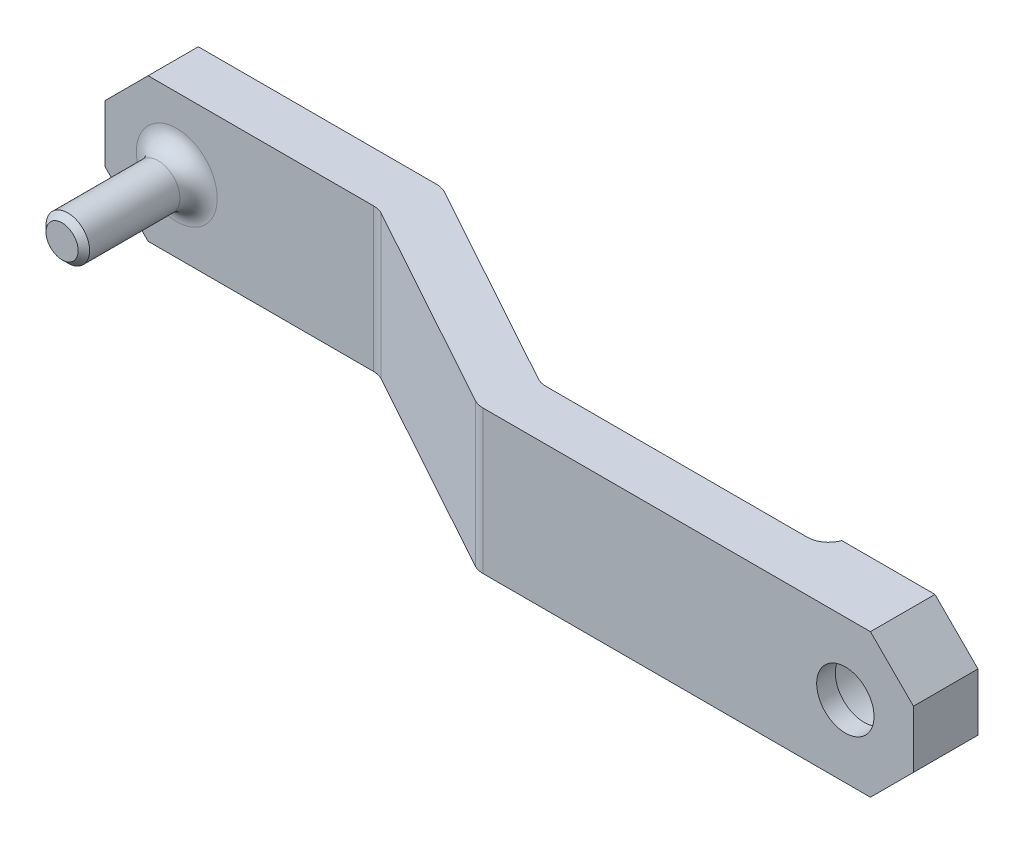
ISO-10303-21;
HEADER;
FILE_DESCRIPTION(('STEP AP214'),'2;1');
FILE_NAME('part.step','',(''),(''),'','','');
FILE_SCHEMA(('AUTOMOTIVE_DESIGN { 1 0 10303 214 1 1 1 1 }'));
ENDSEC;
DATA;
#1=APPLICATION_CONTEXT('core data for automotive mechanical design processes');
#2=APPLICATION_PROTOCOL_DEFINITION('international standard','automotive_design',2000,#1);
#3=PRODUCT_CONTEXT('',#1,'mechanical');
#4=PRODUCT('Part','Part','',(#3));
#5=PRODUCT_RELATED_PRODUCT_CATEGORY('part','',(#4));
#6=PRODUCT_DEFINITION_FORMATION('','',#4);
#7=PRODUCT_DEFINITION_CONTEXT('part definition',#1,'design');
#8=PRODUCT_DEFINITION('design','',#6,#7);
#9=PRODUCT_DEFINITION_SHAPE('','',#8);
#10=(LENGTH_UNIT() NAMED_UNIT(*) SI_UNIT(.MILLI.,.METRE.));
#11=(NAMED_UNIT(*) PLANE_ANGLE_UNIT() SI_UNIT($,.RADIAN.));
#12=(NAMED_UNIT(*) SI_UNIT($,.STERADIAN.) SOLID_ANGLE_UNIT());
#13=UNCERTAINTY_MEASURE_WITH_UNIT(LENGTH_MEASURE(1.E-05),#10,'distance_accuracy_value','');
#14=(GEOMETRIC_REPRESENTATION_CONTEXT(3) GLOBAL_UNCERTAINTY_ASSIGNED_CONTEXT((#13)) GLOBAL_UNIT_ASSIGNED_CONTEXT((#10,
#11,#12)) REPRESENTATION_CONTEXT('',''));
#15=CARTESIAN_POINT('',(0.,0.,0.));
#16=DIRECTION('',(0.,0.,1.));
#17=DIRECTION('',(1.,0.,0.));
#18=AXIS2_PLACEMENT_3D('',#15,#16,#17);
#19=CARTESIAN_POINT('',(25.4,12.7,0.));
#20=DIRECTION('',(0.,0.,1.));
#21=DIRECTION('',(1.,0.,0.));
#22=AXIS2_PLACEMENT_3D('',#19,#20,#21);
#23=PLANE('',#22);
#24=DIRECTION('',(-1.,0.,0.));
#25=VECTOR('',#24,1.);
#26=CARTESIAN_POINT('',(25.4,12.7,0.));
#27=LINE('',#26,#25);
#28=CARTESIAN_POINT('',(24.9106727681502,12.7,0.));
#29=VERTEX_POINT('',#28);
#30=CARTESIAN_POINT('',(3.80999999999999,12.7,0.));
#31=VERTEX_POINT('',#30);
#32=EDGE_CURVE('E532',#29,#31,#27,.T.);
#33=ORIENTED_EDGE('',*,*,#32,.F.);
#34=DIRECTION('',(0.,-1.,0.));
#35=VECTOR('',#34,1.);
#36=CARTESIAN_POINT('',(24.9106727681502,12.7,0.));
#37=LINE('',#36,#35);
#38=CARTESIAN_POINT('',(24.9106727681502,0.,0.));
#39=VERTEX_POINT('',#38);
#40=EDGE_CURVE('E669',#29,#39,#37,.T.);
#41=ORIENTED_EDGE('',*,*,#40,.T.);
#42=DIRECTION('',(-1.,0.,0.));
#43=VECTOR('',#42,1.);
#44=CARTESIAN_POINT('',(25.4,0.,0.));
#45=LINE('',#44,#43);
#46=CARTESIAN_POINT('',(3.81000000000001,0.,0.));
#47=VERTEX_POINT('',#46);
#48=EDGE_CURVE('E531',#39,#47,#45,.T.);
#49=ORIENTED_EDGE('',*,*,#48,.T.);
#50=DIRECTION('',(0.707106781186549,-0.707106781186546,0.));
#51=VECTOR('',#50,1.);
#52=CARTESIAN_POINT('',(0.,3.80999999999999,0.));
#53=LINE('',#52,#51);
#54=CARTESIAN_POINT('',(0.,3.80999999999999,0.));
#55=VERTEX_POINT('',#54);
#56=EDGE_CURVE('E642',#47,#55,#53,.F.);
#57=ORIENTED_EDGE('',*,*,#56,.T.);
#58=DIRECTION('',(0.,-1.,0.));
#59=VECTOR('',#58,1.);
#60=CARTESIAN_POINT('',(0.,12.7,0.));
#61=LINE('',#60,#59);
#62=CARTESIAN_POINT('',(0.,8.88999999999999,0.));
#63=VERTEX_POINT('',#62);
#64=EDGE_CURVE('E579',#63,#55,#61,.T.);
#65=ORIENTED_EDGE('',*,*,#64,.F.);
#66=DIRECTION('',(0.707106781186546,0.707106781186549,0.));
#67=VECTOR('',#66,1.);
#68=CARTESIAN_POINT('',(3.80999999999999,12.7,0.));
#69=LINE('',#68,#67);
#70=EDGE_CURVE('E638',#63,#31,#69,.T.);
#71=ORIENTED_EDGE('',*,*,#70,.T.);
#72=EDGE_LOOP('',(#33,#41,#49,#57,#65,#71));
#73=FACE_BOUND('',#72,.T.);
#74=ADVANCED_FACE('F47',(#73),#23,.F.);
#75=CARTESIAN_POINT('',(0.,12.7,0.));
#76=DIRECTION('',(1.,0.,0.));
#77=DIRECTION('',(0.,0.,-1.));
#78=AXIS2_PLACEMENT_3D('',#75,#76,#77);
#79=PLANE('',#78);
#80=ORIENTED_EDGE('',*,*,#64,.T.);
#81=DIRECTION('',(0.,0.,1.));
#82=VECTOR('',#81,1.);
#83=CARTESIAN_POINT('',(0.,3.80999999999999,0.));
#84=LINE('',#83,#82);
#85=CARTESIAN_POINT('',(0.,3.80999999999999,4.445));
#86=VERTEX_POINT('',#85);
#87=EDGE_CURVE('E628',#55,#86,#84,.T.);
#88=ORIENTED_EDGE('',*,*,#87,.T.);
#89=DIRECTION('',(0.,-1.,0.));
#90=VECTOR('',#89,1.);
#91=CARTESIAN_POINT('',(0.,12.7,4.445));
#92=LINE('',#91,#90);
#93=CARTESIAN_POINT('',(0.,8.88999999999999,4.445));
#94=VERTEX_POINT('',#93);
#95=EDGE_CURVE('E575',#94,#86,#92,.T.);
#96=ORIENTED_EDGE('',*,*,#95,.F.);
#97=DIRECTION('',(0.,0.,-1.));
#98=VECTOR('',#97,1.);
#99=CARTESIAN_POINT('',(0.,8.88999999999999,0.));
#100=LINE('',#99,#98);
#101=EDGE_CURVE('E625',#94,#63,#100,.T.);
#102=ORIENTED_EDGE('',*,*,#101,.T.);
#103=EDGE_LOOP('',(#80,#88,#96,#102));
#104=FACE_BOUND('',#103,.T.);
#105=ADVANCED_FACE('F239',(#104),#79,.F.);
#106=CARTESIAN_POINT('',(0.,12.7,4.445));
#107=DIRECTION('',(0.,0.,-1.));
#108=DIRECTION('',(-1.,0.,0.));
#109=AXIS2_PLACEMENT_3D('',#106,#107,#108);
#110=PLANE('',#109);
#111=CARTESIAN_POINT('',(6.35,6.35,4.445));
#112=DIRECTION('',(0.,0.,-1.));
#113=DIRECTION('',(-1.,0.,0.));
#114=AXIS2_PLACEMENT_3D('',#111,#112,#113);
#115=CIRCLE('',#114,3.5814);
#116=CARTESIAN_POINT('',(2.7686,6.35,4.445));
#117=VERTEX_POINT('',#116);
#118=EDGE_CURVE('E583',#117,#117,#115,.T.);
#119=ORIENTED_EDGE('',*,*,#118,.T.);
#120=EDGE_LOOP('',(#119));
#121=FACE_BOUND('',#120,.T.);
#122=DIRECTION('',(1.,0.,0.));
#123=VECTOR('',#122,1.);
#124=CARTESIAN_POINT('',(0.,0.,4.445));
#125=LINE('',#124,#123);
#126=CARTESIAN_POINT('',(3.81000000000001,0.,4.445));
#127=VERTEX_POINT('',#126);
#128=CARTESIAN_POINT('',(23.7689092271673,0.,4.445));
#129=VERTEX_POINT('',#128);
#130=EDGE_CURVE('E550',#127,#129,#125,.T.);
#131=ORIENTED_EDGE('',*,*,#130,.T.);
#132=DIRECTION('',(0.,-1.,0.));
#133=VECTOR('',#132,1.);
#134=CARTESIAN_POINT('',(23.7689092271673,12.7,4.445));
#135=LINE('',#134,#133);
#136=CARTESIAN_POINT('',(23.7689092271673,12.7,4.445));
#137=VERTEX_POINT('',#136);
#138=EDGE_CURVE('E64',#129,#137,#135,.F.);
#139=ORIENTED_EDGE('',*,*,#138,.T.);
#140=DIRECTION('',(1.,0.,0.));
#141=VECTOR('',#140,1.);
#142=CARTESIAN_POINT('',(0.,12.7,4.445));
#143=LINE('',#142,#141);
#144=CARTESIAN_POINT('',(3.80999999999999,12.7,4.445));
#145=VERTEX_POINT('',#144);
#146=EDGE_CURVE('E535',#145,#137,#143,.T.);
#147=ORIENTED_EDGE('',*,*,#146,.F.);
#148=DIRECTION('',(-0.707106781186546,-0.707106781186549,0.));
#149=VECTOR('',#148,1.);
#150=CARTESIAN_POINT('',(3.80999999999999,12.7,4.445));
#151=LINE('',#150,#149);
#152=EDGE_CURVE('E632',#145,#94,#151,.T.);
#153=ORIENTED_EDGE('',*,*,#152,.T.);
#154=ORIENTED_EDGE('',*,*,#95,.T.);
#155=DIRECTION('',(-0.707106781186549,0.707106781186546,0.));
#156=VECTOR('',#155,1.);
#157=CARTESIAN_POINT('',(0.,3.80999999999999,4.445));
#158=LINE('',#157,#156);
#159=EDGE_CURVE('E635',#86,#127,#158,.F.);
#160=ORIENTED_EDGE('',*,*,#159,.T.);
#161=EDGE_LOOP('',(#131,#139,#147,#153,#154,#160));
#162=FACE_BOUND('',#161,.T.);
#163=ADVANCED_FACE('F247',(#121,#162),#110,.F.);
#164=CARTESIAN_POINT('',(24.2582364590171,12.7,4.445));
#165=DIRECTION('',(0.481931775013495,0.,-0.876208744667811));
#166=DIRECTION('',(-0.876208744667811,0.,-0.481931775013495));
#167=AXIS2_PLACEMENT_3D('',#164,#165,#166);
#168=PLANE('',#167);
#169=DIRECTION('',(0.876208744667811,0.,0.481931775013495));
#170=VECTOR('',#169,1.);
#171=CARTESIAN_POINT('',(24.2582364590171,0.,4.445));
#172=LINE('',#171,#170);
#173=CARTESIAN_POINT('',(24.686989258568,0.,4.68082234140782));
#174=VERTEX_POINT('',#173);
#175=CARTESIAN_POINT('',(43.1969836594662,0.,14.8616776585922));
#176=VERTEX_POINT('',#175);
#177=EDGE_CURVE('E553',#174,#176,#172,.T.);
#178=ORIENTED_EDGE('',*,*,#177,.T.);
#179=DIRECTION('',(0.,-1.,0.));
#180=VECTOR('',#179,1.);
#181=CARTESIAN_POINT('',(43.1969836594662,12.7,14.8616776585922));
#182=LINE('',#181,#180);
#183=CARTESIAN_POINT('',(43.1969836594662,12.7,14.8616776585922));
#184=VERTEX_POINT('',#183);
#185=EDGE_CURVE('E659',#176,#184,#182,.F.);
#186=ORIENTED_EDGE('',*,*,#185,.T.);
#187=DIRECTION('',(0.876208744667811,0.,0.481931775013495));
#188=VECTOR('',#187,1.);
#189=CARTESIAN_POINT('',(24.2582364590171,12.7,4.445));
#190=LINE('',#189,#188);
#191=CARTESIAN_POINT('',(24.686989258568,12.7,4.68082234140782));
#192=VERTEX_POINT('',#191);
#193=EDGE_CURVE('E539',#192,#184,#190,.T.);
#194=ORIENTED_EDGE('',*,*,#193,.F.);
#195=DIRECTION('',(0.,-1.,0.));
#196=VECTOR('',#195,1.);
#197=CARTESIAN_POINT('',(24.686989258568,0.,4.68082234140782));
#198=LINE('',#197,#196);
#199=EDGE_CURVE('E655',#192,#174,#198,.T.);
#200=ORIENTED_EDGE('',*,*,#199,.T.);
#201=EDGE_LOOP('',(#178,#186,#194,#200));
#202=FACE_BOUND('',#201,.T.);
#203=ADVANCED_FACE('F455',(#202),#168,.F.);
#204=CARTESIAN_POINT('',(43.6257364590171,12.7,15.0975));
#205=DIRECTION('',(0.,0.,-1.));
#206=DIRECTION('',(-1.,0.,0.));
#207=AXIS2_PLACEMENT_3D('',#204,#205,#206);
#208=PLANE('',#207);
#209=CARTESIAN_POINT('',(76.2,6.35,15.0975));
#210=DIRECTION('',(0.,0.,-1.));
#211=DIRECTION('',(-1.,0.,0.));
#212=AXIS2_PLACEMENT_3D('',#209,#210,#211);
#213=CIRCLE('',#212,2.54);
#214=CARTESIAN_POINT('',(73.66,6.35,15.0975));
#215=VERTEX_POINT('',#214);
#216=EDGE_CURVE('E518',#215,#215,#213,.T.);
#217=ORIENTED_EDGE('',*,*,#216,.T.);
#218=EDGE_LOOP('',(#217));
#219=FACE_BOUND('',#218,.T.);
#220=DIRECTION('',(1.,0.,0.));
#221=VECTOR('',#220,1.);
#222=CARTESIAN_POINT('',(43.6257364590171,12.7,15.0975));
#223=LINE('',#222,#221);
#224=CARTESIAN_POINT('',(44.1150636908669,12.7,15.0975));
#225=VERTEX_POINT('',#224);
#226=CARTESIAN_POINT('',(78.4225,12.7,15.0975));
#227=VERTEX_POINT('',#226);
#228=EDGE_CURVE('E189',#225,#227,#223,.T.);
#229=ORIENTED_EDGE('',*,*,#228,.F.);
#230=DIRECTION('',(0.,-1.,0.));
#231=VECTOR('',#230,1.);
#232=CARTESIAN_POINT('',(44.1150636908669,12.7,15.0975));
#233=LINE('',#232,#231);
#234=CARTESIAN_POINT('',(44.1150636908669,0.,15.0975));
#235=VERTEX_POINT('',#234);
#236=EDGE_CURVE('E645',#225,#235,#233,.T.);
#237=ORIENTED_EDGE('',*,*,#236,.T.);
#238=DIRECTION('',(1.,0.,0.));
#239=VECTOR('',#238,1.);
#240=CARTESIAN_POINT('',(43.6257364590171,0.,15.0975));
#241=LINE('',#240,#239);
#242=CARTESIAN_POINT('',(78.4225,0.,15.0975));
#243=VERTEX_POINT('',#242);
#244=EDGE_CURVE('E557',#235,#243,#241,.T.);
#245=ORIENTED_EDGE('',*,*,#244,.T.);
#246=DIRECTION('',(-0.707106781186549,-0.707106781186546,0.));
#247=VECTOR('',#246,1.);
#248=CARTESIAN_POINT('',(82.2325,3.80999999999999,15.0975));
#249=LINE('',#248,#247);
#250=CARTESIAN_POINT('',(82.2325,3.80999999999999,15.0975));
#251=VERTEX_POINT('',#250);
#252=EDGE_CURVE('E616',#243,#251,#249,.F.);
#253=ORIENTED_EDGE('',*,*,#252,.T.);
#254=DIRECTION('',(0.,-1.,0.));
#255=VECTOR('',#254,1.);
#256=CARTESIAN_POINT('',(82.2325,12.7,15.0975));
#257=LINE('',#256,#255);
#258=CARTESIAN_POINT('',(82.2325,8.88999999999998,15.0975));
#259=VERTEX_POINT('',#258);
#260=EDGE_CURVE('E571',#259,#251,#257,.T.);
#261=ORIENTED_EDGE('',*,*,#260,.F.);
#262=DIRECTION('',(-0.707106781186546,0.707106781186549,0.));
#263=VECTOR('',#262,1.);
#264=CARTESIAN_POINT('',(78.4225,12.7,15.0975));
#265=LINE('',#264,#263);
#266=EDGE_CURVE('E612',#259,#227,#265,.T.);
#267=ORIENTED_EDGE('',*,*,#266,.T.);
#268=EDGE_LOOP('',(#229,#237,#245,#253,#261,#267));
#269=FACE_BOUND('',#268,.T.);
#270=ADVANCED_FACE('F451',(#219,#269),#208,.F.);
#271=CARTESIAN_POINT('',(82.2325,12.7,15.0975));
#272=DIRECTION('',(-1.,0.,0.));
#273=DIRECTION('',(0.,0.,1.));
#274=AXIS2_PLACEMENT_3D('',#271,#272,#273);
#275=PLANE('',#274);
#276=ORIENTED_EDGE('',*,*,#260,.T.);
#277=DIRECTION('',(0.,0.,-1.));
#278=VECTOR('',#277,1.);
#279=CARTESIAN_POINT('',(82.2325,3.80999999999999,15.0975));
#280=LINE('',#279,#278);
#281=CARTESIAN_POINT('',(82.2325,3.80999999999999,9.38250000000001));
#282=VERTEX_POINT('',#281);
#283=EDGE_CURVE('E594',#251,#282,#280,.T.);
#284=ORIENTED_EDGE('',*,*,#283,.T.);
#285=DIRECTION('',(0.,-1.,0.));
#286=VECTOR('',#285,1.);
#287=CARTESIAN_POINT('',(82.2325,12.7,9.38250000000001));
#288=LINE('',#287,#286);
#289=CARTESIAN_POINT('',(82.2325,8.88999999999998,9.38250000000001));
#290=VERTEX_POINT('',#289);
#291=EDGE_CURVE('E200',#290,#282,#288,.T.);
#292=ORIENTED_EDGE('',*,*,#291,.F.);
#293=DIRECTION('',(0.,0.,1.));
#294=VECTOR('',#293,1.);
#295=CARTESIAN_POINT('',(82.2325,8.88999999999998,15.0975));
#296=LINE('',#295,#294);
#297=EDGE_CURVE('E591',#290,#259,#296,.T.);
#298=ORIENTED_EDGE('',*,*,#297,.T.);
#299=EDGE_LOOP('',(#276,#284,#292,#298));
#300=FACE_BOUND('',#299,.T.);
#301=ADVANCED_FACE('F319',(#300),#275,.F.);
#302=CARTESIAN_POINT('',(82.2325,12.7,9.38250000000001));
#303=DIRECTION('',(0.,0.,1.));
#304=DIRECTION('',(1.,0.,0.));
#305=AXIS2_PLACEMENT_3D('',#302,#303,#304);
#306=PLANE('',#305);
#307=CARTESIAN_POINT('',(76.2,6.35,9.38250000000001));
#308=DIRECTION('',(0.,0.,1.));
#309=DIRECTION('',(1.,0.,0.));
#310=AXIS2_PLACEMENT_3D('',#307,#308,#309);
#311=CIRCLE('',#310,4.73710000000002);
#312=CARTESIAN_POINT('',(80.9371,6.35,9.38250000000001));
#313=VERTEX_POINT('',#312);
#314=EDGE_CURVE('E214',#313,#313,#311,.T.);
#315=ORIENTED_EDGE('',*,*,#314,.T.);
#316=EDGE_LOOP('',(#315));
#317=FACE_BOUND('',#316,.T.);
#318=ORIENTED_EDGE('',*,*,#291,.T.);
#319=DIRECTION('',(0.707106781186549,0.707106781186546,0.));
#320=VECTOR('',#319,1.);
#321=CARTESIAN_POINT('',(82.2325,3.80999999999999,9.38250000000001));
#322=LINE('',#321,#320);
#323=CARTESIAN_POINT('',(78.4225,0.,9.38250000000001));
#324=VERTEX_POINT('',#323);
#325=EDGE_CURVE('E601',#282,#324,#322,.F.);
#326=ORIENTED_EDGE('',*,*,#325,.T.);
#327=DIRECTION('',(-1.,0.,0.));
#328=VECTOR('',#327,1.);
#329=CARTESIAN_POINT('',(82.2325,0.,9.38250000000001));
#330=LINE('',#329,#328);
#331=CARTESIAN_POINT('',(70.1675,0.,9.38250000000001));
#332=VERTEX_POINT('',#331);
#333=EDGE_CURVE('E197',#324,#332,#330,.T.);
#334=ORIENTED_EDGE('',*,*,#333,.T.);
#335=DIRECTION('',(0.,-1.,0.));
#336=VECTOR('',#335,1.);
#337=CARTESIAN_POINT('',(70.1675,12.7,9.38250000000001));
#338=LINE('',#337,#336);
#339=CARTESIAN_POINT('',(70.1675,12.7,9.38250000000001));
#340=VERTEX_POINT('',#339);
#341=EDGE_CURVE('E193',#340,#332,#338,.T.);
#342=ORIENTED_EDGE('',*,*,#341,.F.);
#343=DIRECTION('',(-1.,0.,0.));
#344=VECTOR('',#343,1.);
#345=CARTESIAN_POINT('',(82.2325,12.7,9.38250000000001));
#346=LINE('',#345,#344);
#347=CARTESIAN_POINT('',(78.4225,12.7,9.38250000000001));
#348=VERTEX_POINT('',#347);
#349=EDGE_CURVE('E176',#348,#340,#346,.T.);
#350=ORIENTED_EDGE('',*,*,#349,.F.);
#351=DIRECTION('',(0.707106781186546,-0.707106781186549,0.));
#352=VECTOR('',#351,1.);
#353=CARTESIAN_POINT('',(78.4225,12.7,9.38250000000001));
#354=LINE('',#353,#352);
#355=EDGE_CURVE('E598',#348,#290,#354,.T.);
#356=ORIENTED_EDGE('',*,*,#355,.T.);
#357=EDGE_LOOP('',(#318,#326,#334,#342,#350,#356));
#358=FACE_BOUND('',#357,.T.);
#359=ADVANCED_FACE('F195',(#317,#358),#306,.F.);
#360=CARTESIAN_POINT('',(70.1675,12.7,10.6525));
#361=DIRECTION('',(0.,0.,1.));
#362=DIRECTION('',(1.,0.,0.));
#363=AXIS2_PLACEMENT_3D('',#360,#361,#362);
#364=PLANE('',#363);
#365=DIRECTION('',(-1.,0.,0.));
#366=VECTOR('',#365,1.);
#367=CARTESIAN_POINT('',(70.1675,0.,10.6525));
#368=LINE('',#367,#366);
#369=CARTESIAN_POINT('',(68.3714487757862,0.,10.6525));
#370=VERTEX_POINT('',#369);
#371=CARTESIAN_POINT('',(45.2568272318498,0.,10.6525));
#372=VERTEX_POINT('',#371);
#373=EDGE_CURVE('E562',#370,#372,#368,.T.);
#374=ORIENTED_EDGE('',*,*,#373,.T.);
#375=DIRECTION('',(0.,-1.,0.));
#376=VECTOR('',#375,1.);
#377=CARTESIAN_POINT('',(45.2568272318498,12.7,10.6525));
#378=LINE('',#377,#376);
#379=CARTESIAN_POINT('',(45.2568272318498,12.7,10.6525));
#380=VERTEX_POINT('',#379);
#381=EDGE_CURVE('E682',#372,#380,#378,.F.);
#382=ORIENTED_EDGE('',*,*,#381,.T.);
#383=DIRECTION('',(-1.,0.,0.));
#384=VECTOR('',#383,1.);
#385=CARTESIAN_POINT('',(70.1675,12.7,10.6525));
#386=LINE('',#385,#384);
#387=CARTESIAN_POINT('',(68.3714487757862,12.7,10.6525));
#388=VERTEX_POINT('',#387);
#389=EDGE_CURVE('E188',#388,#380,#386,.T.);
#390=ORIENTED_EDGE('',*,*,#389,.F.);
#391=DIRECTION('',(0.,-1.,0.));
#392=VECTOR('',#391,1.);
#393=CARTESIAN_POINT('',(68.3714487757862,12.7,10.6525));
#394=LINE('',#393,#392);
#395=EDGE_CURVE('E206',#388,#370,#394,.T.);
#396=ORIENTED_EDGE('',*,*,#395,.T.);
#397=EDGE_LOOP('',(#374,#382,#390,#396));
#398=FACE_BOUND('',#397,.T.);
#399=ADVANCED_FACE('F318',(#398),#364,.F.);
#400=CARTESIAN_POINT('',(44.7675,12.7,10.6525));
#401=DIRECTION('',(-0.481931775013495,0.,0.876208744667811));
#402=DIRECTION('',(0.876208744667811,0.,0.481931775013495));
#403=AXIS2_PLACEMENT_3D('',#400,#401,#402);
#404=PLANE('',#403);
#405=DIRECTION('',(-0.876208744667811,0.,-0.481931775013495));
#406=VECTOR('',#405,1.);
#407=CARTESIAN_POINT('',(44.7675,0.,10.6525));
#408=LINE('',#407,#406);
#409=CARTESIAN_POINT('',(44.3387472004491,0.,10.4166776585922));
#410=VERTEX_POINT('',#409);
#411=CARTESIAN_POINT('',(25.8287527995509,0.,0.235822341407819));
#412=VERTEX_POINT('',#411);
#413=EDGE_CURVE('E536',#410,#412,#408,.T.);
#414=ORIENTED_EDGE('',*,*,#413,.T.);
#415=DIRECTION('',(0.,-1.,0.));
#416=VECTOR('',#415,1.);
#417=CARTESIAN_POINT('',(25.8287527995509,12.7,0.235822341407819));
#418=LINE('',#417,#416);
#419=CARTESIAN_POINT('',(25.8287527995509,12.7,0.235822341407819));
#420=VERTEX_POINT('',#419);
#421=EDGE_CURVE('E677',#412,#420,#418,.F.);
#422=ORIENTED_EDGE('',*,*,#421,.T.);
#423=DIRECTION('',(-0.876208744667811,0.,-0.481931775013495));
#424=VECTOR('',#423,1.);
#425=CARTESIAN_POINT('',(44.7675,12.7,10.6525));
#426=LINE('',#425,#424);
#427=CARTESIAN_POINT('',(44.3387472004491,12.7,10.4166776585922));
#428=VERTEX_POINT('',#427);
#429=EDGE_CURVE('E201',#428,#420,#426,.T.);
#430=ORIENTED_EDGE('',*,*,#429,.F.);
#431=DIRECTION('',(0.,-1.,0.));
#432=VECTOR('',#431,1.);
#433=CARTESIAN_POINT('',(44.3387472004491,0.,10.4166776585922));
#434=LINE('',#433,#432);
#435=EDGE_CURVE('E673',#428,#410,#434,.T.);
#436=ORIENTED_EDGE('',*,*,#435,.T.);
#437=EDGE_LOOP('',(#414,#422,#430,#436));
#438=FACE_BOUND('',#437,.T.);
#439=ADVANCED_FACE('F431',(#438),#404,.F.);
#440=CARTESIAN_POINT('',(0.,12.7,0.));
#441=DIRECTION('',(0.,1.,0.));
#442=DIRECTION('',(0.,0.,1.));
#443=AXIS2_PLACEMENT_3D('',#440,#441,#442);
#444=PLANE('',#443);
#445=ORIENTED_EDGE('',*,*,#193,.T.);
#446=CARTESIAN_POINT('',(44.1150636908669,12.7,13.1925));
#447=DIRECTION('',(0.,1.,0.));
#448=DIRECTION('',(0.,0.,1.));
#449=AXIS2_PLACEMENT_3D('',#446,#447,#448);
#450=CIRCLE('',#449,1.905);
#451=EDGE_CURVE('E664',#184,#225,#450,.T.);
#452=ORIENTED_EDGE('',*,*,#451,.T.);
#453=ORIENTED_EDGE('',*,*,#228,.T.);
#454=DIRECTION('',(0.,0.,-1.));
#455=VECTOR('',#454,1.);
#456=CARTESIAN_POINT('',(78.4225,12.7,9.38250000000001));
#457=LINE('',#456,#455);
#458=EDGE_CURVE('E185',#227,#348,#457,.T.);
#459=ORIENTED_EDGE('',*,*,#458,.T.);
#460=ORIENTED_EDGE('',*,*,#349,.T.);
#461=CARTESIAN_POINT('',(68.3714487757862,12.7,8.74750000000001));
#462=DIRECTION('',(0.,1.,0.));
#463=DIRECTION('',(0.,0.,1.));
#464=AXIS2_PLACEMENT_3D('',#461,#462,#463);
#465=CIRCLE('',#464,1.905);
#466=EDGE_CURVE('E182',#340,#388,#465,.F.);
#467=ORIENTED_EDGE('',*,*,#466,.T.);
#468=ORIENTED_EDGE('',*,*,#389,.T.);
#469=CARTESIAN_POINT('',(45.2568272318498,12.7,8.74750000000001));
#470=DIRECTION('',(0.,1.,0.));
#471=DIRECTION('',(0.,0.,1.));
#472=AXIS2_PLACEMENT_3D('',#469,#470,#471);
#473=CIRCLE('',#472,1.905);
#474=EDGE_CURVE('E216',#380,#428,#473,.F.);
#475=ORIENTED_EDGE('',*,*,#474,.T.);
#476=ORIENTED_EDGE('',*,*,#429,.T.);
#477=CARTESIAN_POINT('',(24.9106727681502,12.7,1.905));
#478=DIRECTION('',(0.,1.,0.));
#479=DIRECTION('',(0.,0.,1.));
#480=AXIS2_PLACEMENT_3D('',#477,#478,#479);
#481=CIRCLE('',#480,1.905);
#482=EDGE_CURVE('E72',#420,#29,#481,.T.);
#483=ORIENTED_EDGE('',*,*,#482,.T.);
#484=ORIENTED_EDGE('',*,*,#32,.T.);
#485=DIRECTION('',(0.,0.,1.));
#486=VECTOR('',#485,1.);
#487=CARTESIAN_POINT('',(3.80999999999999,12.7,4.445));
#488=LINE('',#487,#486);
#489=EDGE_CURVE('E619',#31,#145,#488,.T.);
#490=ORIENTED_EDGE('',*,*,#489,.T.);
#491=ORIENTED_EDGE('',*,*,#146,.T.);
#492=CARTESIAN_POINT('',(23.7689092271673,12.7,6.35));
#493=DIRECTION('',(0.,1.,0.));
#494=DIRECTION('',(0.,0.,1.));
#495=AXIS2_PLACEMENT_3D('',#492,#493,#494);
#496=CIRCLE('',#495,1.905);
#497=EDGE_CURVE('E688',#137,#192,#496,.F.);
#498=ORIENTED_EDGE('',*,*,#497,.T.);
#499=EDGE_LOOP('',(#445,#452,#453,#459,#460,#467,#468,#475,#476,#483,#484,#490,#491,#498));
#500=FACE_BOUND('',#499,.T.);
#501=ADVANCED_FACE('F179',(#500),#444,.T.);
#502=CARTESIAN_POINT('',(0.,0.,0.));
#503=DIRECTION('',(0.,1.,0.));
#504=DIRECTION('',(0.,0.,1.));
#505=AXIS2_PLACEMENT_3D('',#502,#503,#504);
#506=PLANE('',#505);
#507=ORIENTED_EDGE('',*,*,#244,.F.);
#508=CARTESIAN_POINT('',(44.1150636908669,0.,13.1925));
#509=DIRECTION('',(0.,1.,0.));
#510=DIRECTION('',(0.,0.,1.));
#511=AXIS2_PLACEMENT_3D('',#508,#509,#510);
#512=CIRCLE('',#511,1.905);
#513=EDGE_CURVE('E652',#235,#176,#512,.F.);
#514=ORIENTED_EDGE('',*,*,#513,.T.);
#515=ORIENTED_EDGE('',*,*,#177,.F.);
#516=CARTESIAN_POINT('',(23.7689092271673,0.,6.35));
#517=DIRECTION('',(0.,1.,0.));
#518=DIRECTION('',(0.,0.,1.));
#519=AXIS2_PLACEMENT_3D('',#516,#517,#518);
#520=CIRCLE('',#519,1.905);
#521=EDGE_CURVE('E685',#174,#129,#520,.T.);
#522=ORIENTED_EDGE('',*,*,#521,.T.);
#523=ORIENTED_EDGE('',*,*,#130,.F.);
#524=DIRECTION('',(0.,0.,-1.));
#525=VECTOR('',#524,1.);
#526=CARTESIAN_POINT('',(3.81000000000001,0.,0.));
#527=LINE('',#526,#525);
#528=EDGE_CURVE('E604',#127,#47,#527,.T.);
#529=ORIENTED_EDGE('',*,*,#528,.T.);
#530=ORIENTED_EDGE('',*,*,#48,.F.);
#531=CARTESIAN_POINT('',(24.9106727681502,0.,1.905));
#532=DIRECTION('',(0.,1.,0.));
#533=DIRECTION('',(0.,0.,1.));
#534=AXIS2_PLACEMENT_3D('',#531,#532,#533);
#535=CIRCLE('',#534,1.905);
#536=EDGE_CURVE('E649',#39,#412,#535,.F.);
#537=ORIENTED_EDGE('',*,*,#536,.T.);
#538=ORIENTED_EDGE('',*,*,#413,.F.);
#539=CARTESIAN_POINT('',(45.2568272318498,0.,8.74750000000001));
#540=DIRECTION('',(0.,1.,0.));
#541=DIRECTION('',(0.,0.,1.));
#542=AXIS2_PLACEMENT_3D('',#539,#540,#541);
#543=CIRCLE('',#542,1.905);
#544=EDGE_CURVE('E691',#410,#372,#543,.T.);
#545=ORIENTED_EDGE('',*,*,#544,.T.);
#546=ORIENTED_EDGE('',*,*,#373,.F.);
#547=CARTESIAN_POINT('',(68.3714487757862,0.,8.74750000000001));
#548=DIRECTION('',(0.,1.,0.));
#549=DIRECTION('',(0.,0.,1.));
#550=AXIS2_PLACEMENT_3D('',#547,#548,#549);
#551=CIRCLE('',#550,1.905);
#552=EDGE_CURVE('E209',#370,#332,#551,.T.);
#553=ORIENTED_EDGE('',*,*,#552,.T.);
#554=ORIENTED_EDGE('',*,*,#333,.F.);
#555=DIRECTION('',(0.,0.,1.));
#556=VECTOR('',#555,1.);
#557=CARTESIAN_POINT('',(78.4225,0.,0.));
#558=LINE('',#557,#556);
#559=EDGE_CURVE('E608',#324,#243,#558,.T.);
#560=ORIENTED_EDGE('',*,*,#559,.T.);
#561=EDGE_LOOP('',(#507,#514,#515,#522,#523,#529,#530,#537,#538,#545,#546,#553,#554,#560));
#562=FACE_BOUND('',#561,.T.);
#563=ADVANCED_FACE('F331',(#562),#506,.F.);
#564=CARTESIAN_POINT('',(76.2,6.35,13.4465));
#565=DIRECTION('',(0.,0.,-1.));
#566=DIRECTION('',(-1.,0.,0.));
#567=AXIS2_PLACEMENT_3D('',#564,#565,#566);
#568=CYLINDRICAL_SURFACE('',#567,4.10209999999999);
#569=CARTESIAN_POINT('',(76.2,6.35,10.0175));
#570=DIRECTION('',(0.,0.,1.));
#571=DIRECTION('',(1.,0.,0.));
#572=AXIS2_PLACEMENT_3D('',#569,#570,#571);
#573=CIRCLE('',#572,4.10209999999999);
#574=CARTESIAN_POINT('',(80.3021,6.35,10.0175));
#575=VERTEX_POINT('',#574);
#576=EDGE_CURVE('E208',#575,#575,#573,.F.);
#577=ORIENTED_EDGE('',*,*,#576,.T.);
#578=EDGE_LOOP('',(#577));
#579=FACE_BOUND('',#578,.T.);
#580=CARTESIAN_POINT('',(76.2,6.35,13.4465));
#581=DIRECTION('',(0.,0.,-1.));
#582=DIRECTION('',(-1.,0.,0.));
#583=AXIS2_PLACEMENT_3D('',#580,#581,#582);
#584=CIRCLE('',#583,4.10209999999999);
#585=CARTESIAN_POINT('',(72.0979,6.35,13.4465));
#586=VERTEX_POINT('',#585);
#587=EDGE_CURVE('E525',#586,#586,#584,.T.);
#588=ORIENTED_EDGE('',*,*,#587,.F.);
#589=EDGE_LOOP('',(#588));
#590=FACE_BOUND('',#589,.T.);
#591=ADVANCED_FACE('F327',(#579,#590),#568,.F.);
#592=CARTESIAN_POINT('',(76.2,6.35,13.4465));
#593=DIRECTION('',(0.,0.,-1.));
#594=DIRECTION('',(-1.,0.,0.));
#595=AXIS2_PLACEMENT_3D('',#592,#593,#594);
#596=PLANE('',#595);
#597=CARTESIAN_POINT('',(76.2,6.35,13.4465));
#598=DIRECTION('',(0.,0.,-1.));
#599=DIRECTION('',(-1.,0.,0.));
#600=AXIS2_PLACEMENT_3D('',#597,#598,#599);
#601=CIRCLE('',#600,2.54);
#602=CARTESIAN_POINT('',(73.66,6.35,13.4465));
#603=VERTEX_POINT('',#602);
#604=EDGE_CURVE('E521',#603,#603,#601,.T.);
#605=ORIENTED_EDGE('',*,*,#604,.F.);
#606=EDGE_LOOP('',(#605));
#607=FACE_BOUND('',#606,.T.);
#608=ORIENTED_EDGE('',*,*,#587,.T.);
#609=EDGE_LOOP('',(#608));
#610=FACE_BOUND('',#609,.T.);
#611=ADVANCED_FACE('F330',(#607,#610),#596,.T.);
#612=CARTESIAN_POINT('',(76.2,6.35,15.0975));
#613=DIRECTION('',(0.,0.,-1.));
#614=DIRECTION('',(-1.,0.,0.));
#615=AXIS2_PLACEMENT_3D('',#612,#613,#614);
#616=CYLINDRICAL_SURFACE('',#615,2.54);
#617=CARTESIAN_POINT('',(73.66,6.35,15.0975));
#618=CARTESIAN_POINT('',(73.66,6.35,15.0803020833333));
#619=CARTESIAN_POINT('',(73.66,6.35,15.0631041666667));
#620=CARTESIAN_POINT('',(73.66,6.35,15.0287083333333));
#621=CARTESIAN_POINT('',(73.66,6.35,15.0115104166667));
#622=CARTESIAN_POINT('',(73.66,6.35,14.9771145833333));
#623=CARTESIAN_POINT('',(73.66,6.35,14.9599166666667));
#624=CARTESIAN_POINT('',(73.66,6.35,14.9255208333333));
#625=CARTESIAN_POINT('',(73.66,6.35,14.9083229166667));
#626=CARTESIAN_POINT('',(73.66,6.35,14.8739270833333));
#627=CARTESIAN_POINT('',(73.66,6.35,14.8567291666667));
#628=CARTESIAN_POINT('',(73.66,6.35,14.8223333333333));
#629=CARTESIAN_POINT('',(73.66,6.35,14.8051354166667));
#630=CARTESIAN_POINT('',(73.66,6.35,14.7707395833333));
#631=CARTESIAN_POINT('',(73.66,6.35,14.7535416666667));
#632=CARTESIAN_POINT('',(73.66,6.35,14.7191458333333));
#633=CARTESIAN_POINT('',(73.66,6.35,14.7019479166667));
#634=CARTESIAN_POINT('',(73.66,6.35,14.6675520833333));
#635=CARTESIAN_POINT('',(73.66,6.35,14.6503541666667));
#636=CARTESIAN_POINT('',(73.66,6.35,14.6159583333333));
#637=CARTESIAN_POINT('',(73.66,6.35,14.5987604166667));
#638=CARTESIAN_POINT('',(73.66,6.35,14.5643645833333));
#639=CARTESIAN_POINT('',(73.66,6.35,14.5471666666667));
#640=CARTESIAN_POINT('',(73.66,6.35,14.5127708333333));
#641=CARTESIAN_POINT('',(73.66,6.35,14.4955729166667));
#642=CARTESIAN_POINT('',(73.66,6.35,14.4611770833333));
#643=CARTESIAN_POINT('',(73.66,6.35,14.4439791666667));
#644=CARTESIAN_POINT('',(73.66,6.35,14.4095833333333));
#645=CARTESIAN_POINT('',(73.66,6.35,14.3923854166667));
#646=CARTESIAN_POINT('',(73.66,6.35,14.3579895833333));
#647=CARTESIAN_POINT('',(73.66,6.35,14.3407916666667));
#648=CARTESIAN_POINT('',(73.66,6.35,14.3063958333333));
#649=CARTESIAN_POINT('',(73.66,6.35,14.2891979166667));
#650=CARTESIAN_POINT('',(73.66,6.35,14.2548020833333));
#651=CARTESIAN_POINT('',(73.66,6.35,14.2376041666667));
#652=CARTESIAN_POINT('',(73.66,6.35,14.2032083333333));
#653=CARTESIAN_POINT('',(73.66,6.35,14.1860104166667));
#654=CARTESIAN_POINT('',(73.66,6.35,14.1516145833333));
#655=CARTESIAN_POINT('',(73.66,6.35,14.1344166666667));
#656=CARTESIAN_POINT('',(73.66,6.35,14.1000208333333));
#657=CARTESIAN_POINT('',(73.66,6.35,14.0828229166667));
#658=CARTESIAN_POINT('',(73.66,6.35,14.0484270833333));
#659=CARTESIAN_POINT('',(73.66,6.35,14.0312291666667));
#660=CARTESIAN_POINT('',(73.66,6.35,13.9968333333333));
#661=CARTESIAN_POINT('',(73.66,6.35,13.9796354166667));
#662=CARTESIAN_POINT('',(73.66,6.35,13.9452395833333));
#663=CARTESIAN_POINT('',(73.66,6.35,13.9280416666667));
#664=CARTESIAN_POINT('',(73.66,6.35,13.8936458333333));
#665=CARTESIAN_POINT('',(73.66,6.35,13.8764479166667));
#666=CARTESIAN_POINT('',(73.66,6.35,13.8420520833333));
#667=CARTESIAN_POINT('',(73.66,6.35,13.8248541666667));
#668=CARTESIAN_POINT('',(73.66,6.35,13.7904583333333));
#669=CARTESIAN_POINT('',(73.66,6.35,13.7732604166667));
#670=CARTESIAN_POINT('',(73.66,6.35,13.7388645833334));
#671=CARTESIAN_POINT('',(73.66,6.35,13.7216666666667));
#672=CARTESIAN_POINT('',(73.66,6.35,13.6872708333334));
#673=CARTESIAN_POINT('',(73.66,6.35,13.6700729166667));
#674=CARTESIAN_POINT('',(73.66,6.35,13.6356770833334));
#675=CARTESIAN_POINT('',(73.66,6.35,13.6184791666667));
#676=CARTESIAN_POINT('',(73.66,6.35,13.5840833333333));
#677=CARTESIAN_POINT('',(73.66,6.35,13.5668854166667));
#678=CARTESIAN_POINT('',(73.66,6.35,13.5324895833334));
#679=CARTESIAN_POINT('',(73.66,6.35,13.5152916666667));
#680=CARTESIAN_POINT('',(73.66,6.35,13.4808958333334));
#681=CARTESIAN_POINT('',(73.66,6.35,13.4636979166667));
#682=CARTESIAN_POINT('',(73.66,6.35,13.4465));
#683=B_SPLINE_CURVE_WITH_KNOTS('',3,(#617,#618,#619,#620,#621,#622,#623,#624,#625,#626,#627,
#628,#629,#630,#631,#632,#633,#634,#635,#636,#637,#638,#639,#640,#641,#642,#643,#644,#645,#646,
#647,#648,#649,#650,#651,#652,#653,#654,#655,#656,#657,#658,#659,#660,#661,#662,#663,#664,#665,
#666,#667,#668,#669,#670,#671,#672,#673,#674,#675,#676,#677,#678,#679,#680,#681,#682),
.UNSPECIFIED.,.F.,.F.,(4,2,2,2,2,2,2,2,2,2,2,2,2,2,2,2,2,2,2,2,2,2,2,2,2,2,2,2,2,2,2,2,4),(0.,
0.0515937500000004,0.103187500000001,0.15478125,0.206375,0.257968749999999,0.309562499999999,
0.361156249999998,0.412749999999998,0.464343749999997,0.515937499999997,0.567531249999996,
0.619124999999996,0.670718749999995,0.722312499999995,0.773906249999994,0.825499999999995,
0.877093749999993,0.928687499999994,0.980281249999992,1.03187499999999,1.08346874999999,
1.13506249999999,1.18665624999999,1.23824999999999,1.28984374999999,1.34143749999999,
1.39303124999999,1.44462499999999,1.49621874999999,1.54781249999999,1.59940624999999,
1.65099999999999),.UNSPECIFIED.);
#684=EDGE_CURVE('BSEAM346',#215,#603,#683,.T.);
#685=ORIENTED_EDGE('',*,*,#216,.F.);
#686=ORIENTED_EDGE('',*,*,#604,.T.);
#687=ORIENTED_EDGE('',*,*,#684,.T.);
#688=ORIENTED_EDGE('',*,*,#684,.F.);
#689=EDGE_LOOP('',(#685,#687,#686,#688));
#690=FACE_BOUND('',#689,.T.);
#691=ADVANCED_FACE('F346',(#690),#616,.F.);
#692=CARTESIAN_POINT('',(6.35,6.35,14.605));
#693=DIRECTION('',(0.,0.,-1.));
#694=DIRECTION('',(-1.,0.,0.));
#695=AXIS2_PLACEMENT_3D('',#692,#693,#694);
#696=CYLINDRICAL_SURFACE('',#695,1.9304);
#697=CARTESIAN_POINT('',(6.35,6.35,14.097));
#698=DIRECTION('',(0.,0.,-1.));
#699=DIRECTION('',(-1.,0.,0.));
#700=AXIS2_PLACEMENT_3D('',#697,#698,#699);
#701=CIRCLE('',#700,1.9304);
#702=CARTESIAN_POINT('',(4.4196,6.35,14.097));
#703=VERTEX_POINT('',#702);
#704=EDGE_CURVE('E57',#703,#703,#701,.T.);
#705=ORIENTED_EDGE('',*,*,#704,.T.);
#706=EDGE_LOOP('',(#705));
#707=FACE_BOUND('',#706,.T.);
#708=CARTESIAN_POINT('',(6.35,6.35,6.096));
#709=DIRECTION('',(0.,0.,-1.));
#710=DIRECTION('',(-1.,0.,0.));
#711=AXIS2_PLACEMENT_3D('',#708,#709,#710);
#712=CIRCLE('',#711,1.9304);
#713=CARTESIAN_POINT('',(4.4196,6.35,6.096));
#714=VERTEX_POINT('',#713);
#715=EDGE_CURVE('E587',#714,#714,#712,.F.);
#716=ORIENTED_EDGE('',*,*,#715,.T.);
#717=EDGE_LOOP('',(#716));
#718=FACE_BOUND('',#717,.T.);
#719=ADVANCED_FACE('F226',(#707,#718),#696,.T.);
#720=CARTESIAN_POINT('',(6.35,6.35,14.605));
#721=DIRECTION('',(0.,0.,-1.));
#722=DIRECTION('',(-1.,0.,0.));
#723=AXIS2_PLACEMENT_3D('',#720,#721,#722);
#724=PLANE('',#723);
#725=CARTESIAN_POINT('',(6.35,6.35,14.605));
#726=DIRECTION('',(0.,0.,-1.));
#727=DIRECTION('',(-1.,0.,0.));
#728=AXIS2_PLACEMENT_3D('',#725,#726,#727);
#729=CIRCLE('',#728,1.42240000000001);
#730=CARTESIAN_POINT('',(4.92759999999999,6.35,14.605));
#731=VERTEX_POINT('',#730);
#732=EDGE_CURVE('E11',#731,#731,#729,.F.);
#733=ORIENTED_EDGE('',*,*,#732,.T.);
#734=EDGE_LOOP('',(#733));
#735=FACE_BOUND('',#734,.T.);
#736=ADVANCED_FACE('F256',(#735),#724,.F.);
#737=CARTESIAN_POINT('',(6.35,6.35,6.096));
#738=DIRECTION('',(0.,0.,-1.));
#739=DIRECTION('',(-1.,0.,0.));
#740=AXIS2_PLACEMENT_3D('',#737,#738,#739);
#741=TOROIDAL_SURFACE('',#740,3.5814,1.651);
#742=ORIENTED_EDGE('',*,*,#715,.F.);
#743=EDGE_LOOP('',(#742));
#744=FACE_BOUND('',#743,.T.);
#745=ORIENTED_EDGE('',*,*,#118,.F.);
#746=EDGE_LOOP('',(#745));
#747=FACE_BOUND('',#746,.T.);
#748=ADVANCED_FACE('F252',(#744,#747),#741,.F.);
#749=CARTESIAN_POINT('',(82.2325,3.80999999999999,15.0975));
#750=DIRECTION('',(-0.707106781186545,0.707106781186549,0.));
#751=DIRECTION('',(0.,0.,-1.));
#752=AXIS2_PLACEMENT_3D('',#749,#750,#751);
#753=PLANE('',#752);
#754=ORIENTED_EDGE('',*,*,#252,.F.);
#755=ORIENTED_EDGE('',*,*,#559,.F.);
#756=ORIENTED_EDGE('',*,*,#325,.F.);
#757=ORIENTED_EDGE('',*,*,#283,.F.);
#758=EDGE_LOOP('',(#754,#755,#756,#757));
#759=FACE_BOUND('',#758,.T.);
#760=ADVANCED_FACE('F255',(#759),#753,.F.);
#761=CARTESIAN_POINT('',(78.4225,12.7,0.));
#762=DIRECTION('',(0.707106781186549,0.707106781186546,0.));
#763=DIRECTION('',(0.,0.,1.));
#764=AXIS2_PLACEMENT_3D('',#761,#762,#763);
#765=PLANE('',#764);
#766=ORIENTED_EDGE('',*,*,#266,.F.);
#767=ORIENTED_EDGE('',*,*,#297,.F.);
#768=ORIENTED_EDGE('',*,*,#355,.F.);
#769=ORIENTED_EDGE('',*,*,#458,.F.);
#770=EDGE_LOOP('',(#766,#767,#768,#769));
#771=FACE_BOUND('',#770,.T.);
#772=ADVANCED_FACE('F264',(#771),#765,.T.);
#773=CARTESIAN_POINT('',(0.,3.80999999999999,0.));
#774=DIRECTION('',(0.707106781186545,0.707106781186549,0.));
#775=DIRECTION('',(0.,0.,1.));
#776=AXIS2_PLACEMENT_3D('',#773,#774,#775);
#777=PLANE('',#776);
#778=ORIENTED_EDGE('',*,*,#56,.F.);
#779=ORIENTED_EDGE('',*,*,#528,.F.);
#780=ORIENTED_EDGE('',*,*,#159,.F.);
#781=ORIENTED_EDGE('',*,*,#87,.F.);
#782=EDGE_LOOP('',(#778,#779,#780,#781));
#783=FACE_BOUND('',#782,.T.);
#784=ADVANCED_FACE('F271',(#783),#777,.F.);
#785=CARTESIAN_POINT('',(3.80999999999999,12.7,0.));
#786=DIRECTION('',(-0.707106781186549,0.707106781186545,0.));
#787=DIRECTION('',(0.,0.,-1.));
#788=AXIS2_PLACEMENT_3D('',#785,#786,#787);
#789=PLANE('',#788);
#790=ORIENTED_EDGE('',*,*,#70,.F.);
#791=ORIENTED_EDGE('',*,*,#101,.F.);
#792=ORIENTED_EDGE('',*,*,#152,.F.);
#793=ORIENTED_EDGE('',*,*,#489,.F.);
#794=EDGE_LOOP('',(#790,#791,#792,#793));
#795=FACE_BOUND('',#794,.T.);
#796=ADVANCED_FACE('F278',(#795),#789,.T.);
#797=CARTESIAN_POINT('',(44.1150636908669,12.7,13.1925));
#798=DIRECTION('',(0.,-1.,0.));
#799=DIRECTION('',(0.,0.,-1.));
#800=AXIS2_PLACEMENT_3D('',#797,#798,#799);
#801=CYLINDRICAL_SURFACE('',#800,1.905);
#802=ORIENTED_EDGE('',*,*,#451,.F.);
#803=ORIENTED_EDGE('',*,*,#185,.F.);
#804=ORIENTED_EDGE('',*,*,#513,.F.);
#805=ORIENTED_EDGE('',*,*,#236,.F.);
#806=EDGE_LOOP('',(#802,#803,#804,#805));
#807=FACE_BOUND('',#806,.T.);
#808=ADVANCED_FACE('F284',(#807),#801,.T.);
#809=CARTESIAN_POINT('',(23.7689092271673,12.7,6.35));
#810=DIRECTION('',(0.,1.,0.));
#811=DIRECTION('',(0.,0.,1.));
#812=AXIS2_PLACEMENT_3D('',#809,#810,#811);
#813=CYLINDRICAL_SURFACE('',#812,1.905);
#814=ORIENTED_EDGE('',*,*,#497,.F.);
#815=ORIENTED_EDGE('',*,*,#138,.F.);
#816=ORIENTED_EDGE('',*,*,#521,.F.);
#817=ORIENTED_EDGE('',*,*,#199,.F.);
#818=EDGE_LOOP('',(#814,#815,#816,#817));
#819=FACE_BOUND('',#818,.T.);
#820=ADVANCED_FACE('F288',(#819),#813,.F.);
#821=CARTESIAN_POINT('',(24.9106727681502,12.7,1.905));
#822=DIRECTION('',(0.,-1.,0.));
#823=DIRECTION('',(0.,0.,-1.));
#824=AXIS2_PLACEMENT_3D('',#821,#822,#823);
#825=CYLINDRICAL_SURFACE('',#824,1.905);
#826=ORIENTED_EDGE('',*,*,#482,.F.);
#827=ORIENTED_EDGE('',*,*,#421,.F.);
#828=ORIENTED_EDGE('',*,*,#536,.F.);
#829=ORIENTED_EDGE('',*,*,#40,.F.);
#830=EDGE_LOOP('',(#826,#827,#828,#829));
#831=FACE_BOUND('',#830,.T.);
#832=ADVANCED_FACE('F292',(#831),#825,.T.);
#833=CARTESIAN_POINT('',(45.2568272318498,12.7,8.74750000000001));
#834=DIRECTION('',(0.,1.,0.));
#835=DIRECTION('',(0.,0.,1.));
#836=AXIS2_PLACEMENT_3D('',#833,#834,#835);
#837=CYLINDRICAL_SURFACE('',#836,1.905);
#838=ORIENTED_EDGE('',*,*,#474,.F.);
#839=ORIENTED_EDGE('',*,*,#381,.F.);
#840=ORIENTED_EDGE('',*,*,#544,.F.);
#841=ORIENTED_EDGE('',*,*,#435,.F.);
#842=EDGE_LOOP('',(#838,#839,#840,#841));
#843=FACE_BOUND('',#842,.T.);
#844=ADVANCED_FACE('F296',(#843),#837,.F.);
#845=CARTESIAN_POINT('',(68.3714487757862,12.7,8.74750000000001));
#846=DIRECTION('',(0.,-1.,0.));
#847=DIRECTION('',(0.,0.,-1.));
#848=AXIS2_PLACEMENT_3D('',#845,#846,#847);
#849=CYLINDRICAL_SURFACE('',#848,1.905);
#850=ORIENTED_EDGE('',*,*,#466,.F.);
#851=ORIENTED_EDGE('',*,*,#341,.T.);
#852=ORIENTED_EDGE('',*,*,#552,.F.);
#853=ORIENTED_EDGE('',*,*,#395,.F.);
#854=EDGE_LOOP('',(#850,#851,#852,#853));
#855=FACE_BOUND('',#854,.T.);
#856=ADVANCED_FACE('F204',(#855),#849,.F.);
#857=CARTESIAN_POINT('',(76.2,6.35,10.0175));
#858=DIRECTION('',(0.,0.,-1.));
#859=DIRECTION('',(-1.,0.,0.));
#860=AXIS2_PLACEMENT_3D('',#857,#858,#859);
#861=CONICAL_SURFACE('',#860,4.10209999999999,0.785398163397453);
#862=ORIENTED_EDGE('',*,*,#314,.F.);
#863=EDGE_LOOP('',(#862));
#864=FACE_BOUND('',#863,.T.);
#865=ORIENTED_EDGE('',*,*,#576,.F.);
#866=EDGE_LOOP('',(#865));
#867=FACE_BOUND('',#866,.T.);
#868=ADVANCED_FACE('F230',(#864,#867),#861,.F.);
#869=CARTESIAN_POINT('',(6.35,6.35,14.097));
#870=DIRECTION('',(0.,0.,-1.));
#871=DIRECTION('',(-1.,0.,0.));
#872=AXIS2_PLACEMENT_3D('',#869,#870,#871);
#873=CONICAL_SURFACE('',#872,1.9304,0.785398163397447);
#874=ORIENTED_EDGE('',*,*,#732,.F.);
#875=EDGE_LOOP('',(#874));
#876=FACE_BOUND('',#875,.T.);
#877=ORIENTED_EDGE('',*,*,#704,.F.);
#878=EDGE_LOOP('',(#877));
#879=FACE_BOUND('',#878,.T.);
#880=ADVANCED_FACE('F50',(#876,#879),#873,.T.);
#881=CLOSED_SHELL('',(#74,#105,#163,#203,#270,#301,#359,#399,#439,#501,#563,#591,#611,#691,#719,
#736,#748,#760,#772,#784,#796,#808,#820,#832,#844,#856,#868,#880));
#882=MANIFOLD_SOLID_BREP('B2',#881);
#883=ADVANCED_BREP_SHAPE_REPRESENTATION('',(#18,#882),#14);
#884=SHAPE_DEFINITION_REPRESENTATION(#9,#883);
ENDSEC;
END-ISO-10303-21;
